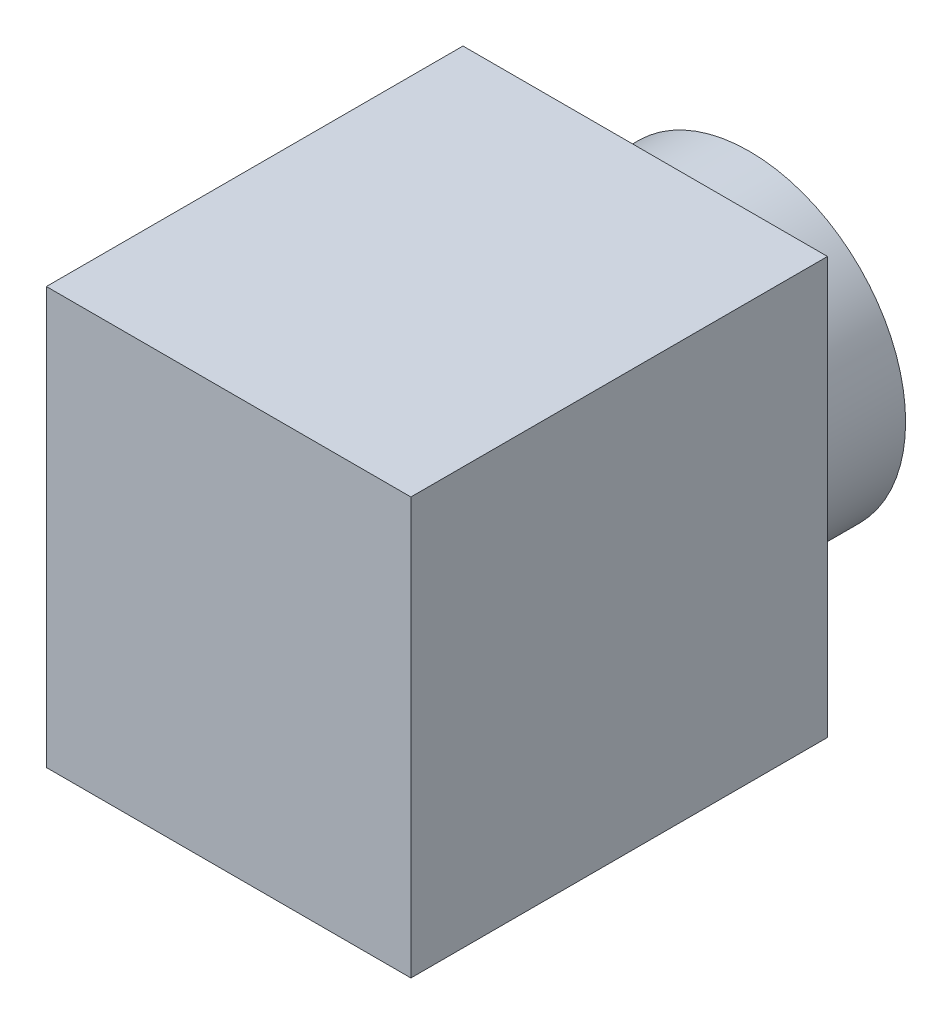
ISO-10303-21;
HEADER;
FILE_DESCRIPTION(('STEP AP214'),'2;1');
FILE_NAME('part.step','',(''),(''),'','','');
FILE_SCHEMA(('AUTOMOTIVE_DESIGN { 1 0 10303 214 1 1 1 1 }'));
ENDSEC;
DATA;
#1=APPLICATION_CONTEXT('core data for automotive mechanical design processes');
#2=APPLICATION_PROTOCOL_DEFINITION('international standard','automotive_design',2000,#1);
#3=PRODUCT_CONTEXT('',#1,'mechanical');
#4=PRODUCT('Part','Part','',(#3));
#5=PRODUCT_RELATED_PRODUCT_CATEGORY('part','',(#4));
#6=PRODUCT_DEFINITION_FORMATION('','',#4);
#7=PRODUCT_DEFINITION_CONTEXT('part definition',#1,'design');
#8=PRODUCT_DEFINITION('design','',#6,#7);
#9=PRODUCT_DEFINITION_SHAPE('','',#8);
#10=(LENGTH_UNIT() NAMED_UNIT(*) SI_UNIT(.MILLI.,.METRE.));
#11=(NAMED_UNIT(*) PLANE_ANGLE_UNIT() SI_UNIT($,.RADIAN.));
#12=(NAMED_UNIT(*) SI_UNIT($,.STERADIAN.) SOLID_ANGLE_UNIT());
#13=UNCERTAINTY_MEASURE_WITH_UNIT(LENGTH_MEASURE(1.E-05),#10,'distance_accuracy_value','');
#14=(GEOMETRIC_REPRESENTATION_CONTEXT(3) GLOBAL_UNCERTAINTY_ASSIGNED_CONTEXT((#13)) GLOBAL_UNIT_ASSIGNED_CONTEXT((#10,
#11,#12)) REPRESENTATION_CONTEXT('',''));
#15=CARTESIAN_POINT('',(0.,0.,0.));
#16=DIRECTION('',(0.,0.,1.));
#17=DIRECTION('',(1.,0.,0.));
#18=AXIS2_PLACEMENT_3D('',#15,#16,#17);
#19=CARTESIAN_POINT('',(0.,0.,80.));
#20=DIRECTION('',(1.,0.,0.));
#21=DIRECTION('',(0.,0.,-1.));
#22=AXIS2_PLACEMENT_3D('',#19,#20,#21);
#23=PLANE('',#22);
#24=CARTESIAN_POINT('',(0.,40.,40.));
#25=DIRECTION('',(-1.,0.,0.));
#26=DIRECTION('',(0.,0.,1.));
#27=AXIS2_PLACEMENT_3D('',#24,#25,#26);
#28=CIRCLE('',#27,21.);
#29=CARTESIAN_POINT('',(0.,40.,61.));
#30=VERTEX_POINT('',#29);
#31=EDGE_CURVE('E134',#30,#30,#28,.T.);
#32=ORIENTED_EDGE('',*,*,#31,.F.);
#33=EDGE_LOOP('',(#32));
#34=FACE_BOUND('',#33,.T.);
#35=DIRECTION('',(0.,-1.,0.));
#36=VECTOR('',#35,1.);
#37=CARTESIAN_POINT('',(0.,0.,0.));
#38=LINE('',#37,#36);
#39=CARTESIAN_POINT('',(0.,80.,0.));
#40=VERTEX_POINT('',#39);
#41=CARTESIAN_POINT('',(0.,0.,0.));
#42=VERTEX_POINT('',#41);
#43=EDGE_CURVE('E109',#40,#42,#38,.T.);
#44=ORIENTED_EDGE('',*,*,#43,.T.);
#45=DIRECTION('',(0.,0.,-1.));
#46=VECTOR('',#45,1.);
#47=CARTESIAN_POINT('',(0.,0.,80.));
#48=LINE('',#47,#46);
#49=CARTESIAN_POINT('',(0.,0.,80.));
#50=VERTEX_POINT('',#49);
#51=EDGE_CURVE('E41',#50,#42,#48,.T.);
#52=ORIENTED_EDGE('',*,*,#51,.F.);
#53=DIRECTION('',(0.,-1.,0.));
#54=VECTOR('',#53,1.);
#55=CARTESIAN_POINT('',(0.,0.,80.));
#56=LINE('',#55,#54);
#57=CARTESIAN_POINT('',(0.,80.,80.));
#58=VERTEX_POINT('',#57);
#59=EDGE_CURVE('E92',#58,#50,#56,.T.);
#60=ORIENTED_EDGE('',*,*,#59,.F.);
#61=DIRECTION('',(0.,0.,-1.));
#62=VECTOR('',#61,1.);
#63=CARTESIAN_POINT('',(0.,80.,80.));
#64=LINE('',#63,#62);
#65=EDGE_CURVE('E105',#58,#40,#64,.T.);
#66=ORIENTED_EDGE('',*,*,#65,.T.);
#67=EDGE_LOOP('',(#44,#52,#60,#66));
#68=FACE_BOUND('',#67,.T.);
#69=ADVANCED_FACE('F38',(#34,#68),#23,.F.);
#70=CARTESIAN_POINT('',(0.,0.,80.));
#71=DIRECTION('',(0.,1.,0.));
#72=DIRECTION('',(0.,0.,1.));
#73=AXIS2_PLACEMENT_3D('',#70,#71,#72);
#74=PLANE('',#73);
#75=DIRECTION('',(1.,0.,0.));
#76=VECTOR('',#75,1.);
#77=CARTESIAN_POINT('',(0.,0.,0.));
#78=LINE('',#77,#76);
#79=CARTESIAN_POINT('',(70.,0.,0.));
#80=VERTEX_POINT('',#79);
#81=EDGE_CURVE('E98',#42,#80,#78,.T.);
#82=ORIENTED_EDGE('',*,*,#81,.T.);
#83=DIRECTION('',(0.,0.,-1.));
#84=VECTOR('',#83,1.);
#85=CARTESIAN_POINT('',(70.,0.,80.));
#86=LINE('',#85,#84);
#87=CARTESIAN_POINT('',(70.,0.,80.));
#88=VERTEX_POINT('',#87);
#89=EDGE_CURVE('E96',#88,#80,#86,.T.);
#90=ORIENTED_EDGE('',*,*,#89,.F.);
#91=DIRECTION('',(1.,0.,0.));
#92=VECTOR('',#91,1.);
#93=CARTESIAN_POINT('',(0.,0.,80.));
#94=LINE('',#93,#92);
#95=EDGE_CURVE('E87',#50,#88,#94,.T.);
#96=ORIENTED_EDGE('',*,*,#95,.F.);
#97=ORIENTED_EDGE('',*,*,#51,.T.);
#98=EDGE_LOOP('',(#82,#90,#96,#97));
#99=FACE_BOUND('',#98,.T.);
#100=ADVANCED_FACE('F97',(#99),#74,.F.);
#101=CARTESIAN_POINT('',(70.,0.,80.));
#102=DIRECTION('',(-1.,0.,0.));
#103=DIRECTION('',(0.,-1.,0.));
#104=AXIS2_PLACEMENT_3D('',#101,#102,#103);
#105=PLANE('',#104);
#106=DIRECTION('',(0.,1.,0.));
#107=VECTOR('',#106,1.);
#108=CARTESIAN_POINT('',(70.,0.,0.));
#109=LINE('',#108,#107);
#110=CARTESIAN_POINT('',(70.,80.,0.));
#111=VERTEX_POINT('',#110);
#112=EDGE_CURVE('E73',#80,#111,#109,.T.);
#113=ORIENTED_EDGE('',*,*,#112,.T.);
#114=DIRECTION('',(0.,0.,-1.));
#115=VECTOR('',#114,1.);
#116=CARTESIAN_POINT('',(70.,80.,80.));
#117=LINE('',#116,#115);
#118=CARTESIAN_POINT('',(70.,80.,80.));
#119=VERTEX_POINT('',#118);
#120=EDGE_CURVE('E100',#119,#111,#117,.T.);
#121=ORIENTED_EDGE('',*,*,#120,.F.);
#122=DIRECTION('',(0.,1.,0.));
#123=VECTOR('',#122,1.);
#124=CARTESIAN_POINT('',(70.,0.,80.));
#125=LINE('',#124,#123);
#126=EDGE_CURVE('E90',#88,#119,#125,.T.);
#127=ORIENTED_EDGE('',*,*,#126,.F.);
#128=ORIENTED_EDGE('',*,*,#89,.T.);
#129=EDGE_LOOP('',(#113,#121,#127,#128));
#130=FACE_BOUND('',#129,.T.);
#131=ADVANCED_FACE('F101',(#130),#105,.F.);
#132=CARTESIAN_POINT('',(0.,80.,80.));
#133=DIRECTION('',(0.,-1.,0.));
#134=DIRECTION('',(0.,0.,-1.));
#135=AXIS2_PLACEMENT_3D('',#132,#133,#134);
#136=PLANE('',#135);
#137=DIRECTION('',(-1.,0.,0.));
#138=VECTOR('',#137,1.);
#139=CARTESIAN_POINT('',(0.,80.,0.));
#140=LINE('',#139,#138);
#141=EDGE_CURVE('E79',#111,#40,#140,.T.);
#142=ORIENTED_EDGE('',*,*,#141,.T.);
#143=ORIENTED_EDGE('',*,*,#65,.F.);
#144=DIRECTION('',(-1.,0.,0.));
#145=VECTOR('',#144,1.);
#146=CARTESIAN_POINT('',(0.,80.,80.));
#147=LINE('',#146,#145);
#148=EDGE_CURVE('E56',#119,#58,#147,.T.);
#149=ORIENTED_EDGE('',*,*,#148,.F.);
#150=ORIENTED_EDGE('',*,*,#120,.T.);
#151=EDGE_LOOP('',(#142,#143,#149,#150));
#152=FACE_BOUND('',#151,.T.);
#153=ADVANCED_FACE('F123',(#152),#136,.F.);
#154=CARTESIAN_POINT('',(0.,0.,80.));
#155=DIRECTION('',(0.,0.,-1.));
#156=DIRECTION('',(-1.,0.,0.));
#157=AXIS2_PLACEMENT_3D('',#154,#155,#156);
#158=PLANE('',#157);
#159=ORIENTED_EDGE('',*,*,#59,.T.);
#160=ORIENTED_EDGE('',*,*,#95,.T.);
#161=ORIENTED_EDGE('',*,*,#126,.T.);
#162=ORIENTED_EDGE('',*,*,#148,.T.);
#163=EDGE_LOOP('',(#159,#160,#161,#162));
#164=FACE_BOUND('',#163,.T.);
#165=ADVANCED_FACE('F88',(#164),#158,.F.);
#166=CARTESIAN_POINT('',(0.,0.,0.));
#167=DIRECTION('',(0.,0.,-1.));
#168=DIRECTION('',(-1.,0.,0.));
#169=AXIS2_PLACEMENT_3D('',#166,#167,#168);
#170=PLANE('',#169);
#171=CARTESIAN_POINT('',(35.,40.,0.));
#172=DIRECTION('',(0.,0.,-1.));
#173=DIRECTION('',(-1.,0.,0.));
#174=AXIS2_PLACEMENT_3D('',#171,#172,#173);
#175=CIRCLE('',#174,30.);
#176=CARTESIAN_POINT('',(5.00000000000003,40.,0.));
#177=VERTEX_POINT('',#176);
#178=EDGE_CURVE('E11',#177,#177,#175,.T.);
#179=ORIENTED_EDGE('',*,*,#178,.F.);
#180=EDGE_LOOP('',(#179));
#181=FACE_BOUND('',#180,.T.);
#182=ORIENTED_EDGE('',*,*,#43,.F.);
#183=ORIENTED_EDGE('',*,*,#141,.F.);
#184=ORIENTED_EDGE('',*,*,#112,.F.);
#185=ORIENTED_EDGE('',*,*,#81,.F.);
#186=EDGE_LOOP('',(#182,#183,#184,#185));
#187=FACE_BOUND('',#186,.T.);
#188=ADVANCED_FACE('F126',(#181,#187),#170,.T.);
#189=CARTESIAN_POINT('',(35.,40.,-20.));
#190=DIRECTION('',(0.,0.,1.));
#191=DIRECTION('',(1.,0.,0.));
#192=AXIS2_PLACEMENT_3D('',#189,#190,#191);
#193=CYLINDRICAL_SURFACE('',#192,30.);
#194=CARTESIAN_POINT('',(35.,40.,-20.));
#195=DIRECTION('',(0.,0.,-1.));
#196=DIRECTION('',(-1.,0.,0.));
#197=AXIS2_PLACEMENT_3D('',#194,#195,#196);
#198=CIRCLE('',#197,30.);
#199=CARTESIAN_POINT('',(5.00000000000003,40.,-20.));
#200=VERTEX_POINT('',#199);
#201=EDGE_CURVE('E113',#200,#200,#198,.T.);
#202=ORIENTED_EDGE('',*,*,#201,.F.);
#203=EDGE_LOOP('',(#202));
#204=FACE_BOUND('',#203,.T.);
#205=ORIENTED_EDGE('',*,*,#178,.T.);
#206=EDGE_LOOP('',(#205));
#207=FACE_BOUND('',#206,.T.);
#208=ADVANCED_FACE('F164',(#204,#207),#193,.T.);
#209=CARTESIAN_POINT('',(35.,40.,-20.));
#210=DIRECTION('',(0.,0.,-1.));
#211=DIRECTION('',(-1.,0.,0.));
#212=AXIS2_PLACEMENT_3D('',#209,#210,#211);
#213=PLANE('',#212);
#214=ORIENTED_EDGE('',*,*,#201,.T.);
#215=EDGE_LOOP('',(#214));
#216=FACE_BOUND('',#215,.T.);
#217=ADVANCED_FACE('F147',(#216),#213,.T.);
#218=CARTESIAN_POINT('',(15.,40.,40.));
#219=DIRECTION('',(-1.,0.,0.));
#220=DIRECTION('',(0.,0.,1.));
#221=AXIS2_PLACEMENT_3D('',#218,#219,#220);
#222=CYLINDRICAL_SURFACE('',#221,21.);
#223=CARTESIAN_POINT('',(15.,40.,40.));
#224=DIRECTION('',(-1.,0.,0.));
#225=DIRECTION('',(0.,0.,1.));
#226=AXIS2_PLACEMENT_3D('',#223,#224,#225);
#227=CIRCLE('',#226,21.);
#228=CARTESIAN_POINT('',(15.,40.,61.));
#229=VERTEX_POINT('',#228);
#230=EDGE_CURVE('E133',#229,#229,#227,.T.);
#231=ORIENTED_EDGE('',*,*,#230,.F.);
#232=EDGE_LOOP('',(#231));
#233=FACE_BOUND('',#232,.T.);
#234=ORIENTED_EDGE('',*,*,#31,.T.);
#235=EDGE_LOOP('',(#234));
#236=FACE_BOUND('',#235,.T.);
#237=ADVANCED_FACE('F144',(#233,#236),#222,.F.);
#238=CARTESIAN_POINT('',(15.,40.,40.));
#239=DIRECTION('',(-1.,0.,0.));
#240=DIRECTION('',(0.,0.,1.));
#241=AXIS2_PLACEMENT_3D('',#238,#239,#240);
#242=PLANE('',#241);
#243=ORIENTED_EDGE('',*,*,#230,.T.);
#244=EDGE_LOOP('',(#243));
#245=FACE_BOUND('',#244,.T.);
#246=ADVANCED_FACE('F142',(#245),#242,.T.);
#247=CLOSED_SHELL('',(#69,#100,#131,#153,#165,#188,#208,#217,#237,#246));
#248=MANIFOLD_SOLID_BREP('B2',#247);
#249=ADVANCED_BREP_SHAPE_REPRESENTATION('',(#18,#248),#14);
#250=SHAPE_DEFINITION_REPRESENTATION(#9,#249);
ENDSEC;
END-ISO-10303-21;
